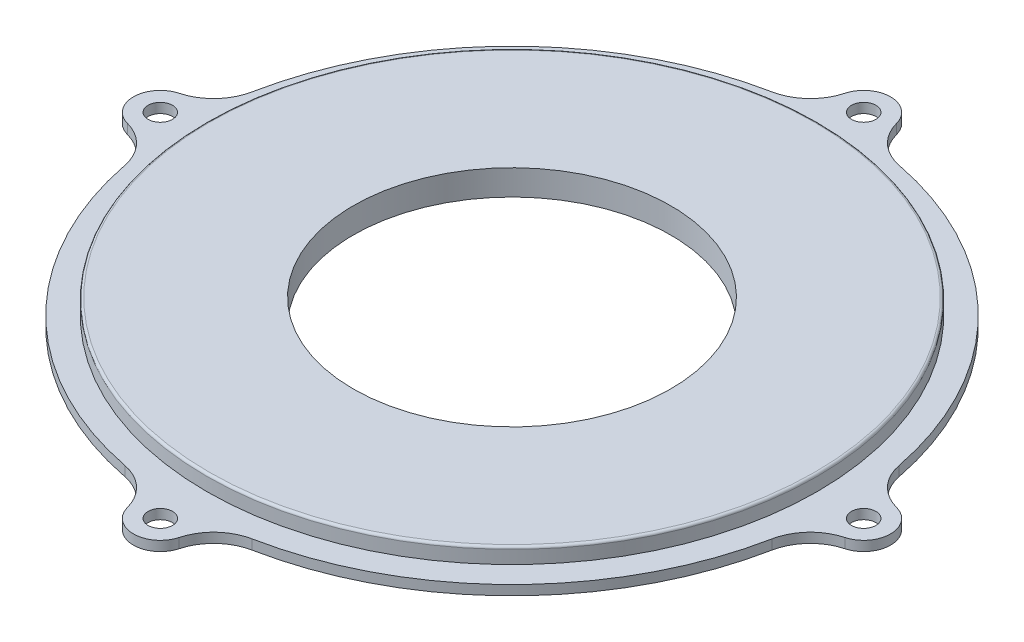
ISO-10303-21;
HEADER;
FILE_DESCRIPTION(('STEP AP214'),'2;1');
FILE_NAME('part.step','',(''),(''),'','','');
FILE_SCHEMA(('AUTOMOTIVE_DESIGN { 1 0 10303 214 1 1 1 1 }'));
ENDSEC;
DATA;
#1=APPLICATION_CONTEXT('core data for automotive mechanical design processes');
#2=APPLICATION_PROTOCOL_DEFINITION('international standard','automotive_design',2000,#1);
#3=PRODUCT_CONTEXT('',#1,'mechanical');
#4=PRODUCT('Part','Part','',(#3));
#5=PRODUCT_RELATED_PRODUCT_CATEGORY('part','',(#4));
#6=PRODUCT_DEFINITION_FORMATION('','',#4);
#7=PRODUCT_DEFINITION_CONTEXT('part definition',#1,'design');
#8=PRODUCT_DEFINITION('design','',#6,#7);
#9=PRODUCT_DEFINITION_SHAPE('','',#8);
#10=(LENGTH_UNIT() NAMED_UNIT(*) SI_UNIT(.MILLI.,.METRE.));
#11=(NAMED_UNIT(*) PLANE_ANGLE_UNIT() SI_UNIT($,.RADIAN.));
#12=(NAMED_UNIT(*) SI_UNIT($,.STERADIAN.) SOLID_ANGLE_UNIT());
#13=UNCERTAINTY_MEASURE_WITH_UNIT(LENGTH_MEASURE(1.E-05),#10,'distance_accuracy_value','');
#14=(GEOMETRIC_REPRESENTATION_CONTEXT(3) GLOBAL_UNCERTAINTY_ASSIGNED_CONTEXT((#13)) GLOBAL_UNIT_ASSIGNED_CONTEXT((#10,
#11,#12)) REPRESENTATION_CONTEXT('',''));
#15=CARTESIAN_POINT('',(0.,0.,0.));
#16=DIRECTION('',(0.,0.,1.));
#17=DIRECTION('',(1.,0.,0.));
#18=AXIS2_PLACEMENT_3D('',#15,#16,#17);
#19=CARTESIAN_POINT('',(0.,-2.,0.));
#20=DIRECTION('',(0.,1.,0.));
#21=DIRECTION('',(0.,0.,1.));
#22=AXIS2_PLACEMENT_3D('',#19,#20,#21);
#23=CYLINDRICAL_SURFACE('',#22,67.5);
#24=DIRECTION('',(0.,-1.,0.));
#25=VECTOR('',#24,1.);
#26=CARTESIAN_POINT('',(13.0329760411852,0.,-66.2298387096775));
#27=LINE('',#26,#25);
#28=CARTESIAN_POINT('',(13.0329760411852,0.,-66.2298387096775));
#29=VERTEX_POINT('',#28);
#30=CARTESIAN_POINT('',(13.0329760411852,-2.,-66.2298387096775));
#31=VERTEX_POINT('',#30);
#32=EDGE_CURVE('E242',#29,#31,#27,.T.);
#33=ORIENTED_EDGE('',*,*,#32,.F.);
#34=CARTESIAN_POINT('',(0.,0.,0.));
#35=DIRECTION('',(0.,-1.,0.));
#36=DIRECTION('',(0.,0.,-1.));
#37=AXIS2_PLACEMENT_3D('',#34,#35,#36);
#38=CIRCLE('',#37,67.5);
#39=CARTESIAN_POINT('',(66.2298387096774,0.,-13.0329760411855));
#40=VERTEX_POINT('',#39);
#41=EDGE_CURVE('E281',#29,#40,#38,.T.);
#42=ORIENTED_EDGE('',*,*,#41,.T.);
#43=DIRECTION('',(0.,-1.,0.));
#44=VECTOR('',#43,1.);
#45=CARTESIAN_POINT('',(66.2298387096774,0.,-13.0329760411855));
#46=LINE('',#45,#44);
#47=CARTESIAN_POINT('',(66.2298387096774,-2.,-13.0329760411855));
#48=VERTEX_POINT('',#47);
#49=EDGE_CURVE('E284',#40,#48,#46,.T.);
#50=ORIENTED_EDGE('',*,*,#49,.T.);
#51=CARTESIAN_POINT('',(0.,-2.,0.));
#52=DIRECTION('',(0.,-1.,0.));
#53=DIRECTION('',(0.,0.,-1.));
#54=AXIS2_PLACEMENT_3D('',#51,#52,#53);
#55=CIRCLE('',#54,67.5);
#56=EDGE_CURVE('E294',#31,#48,#55,.T.);
#57=ORIENTED_EDGE('',*,*,#56,.F.);
#58=EDGE_LOOP('',(#33,#42,#50,#57));
#59=FACE_BOUND('',#58,.T.);
#60=ADVANCED_FACE('F43',(#59),#23,.T.);
#61=DIRECTION('',(0.,-1.,0.));
#62=VECTOR('',#61,1.);
#63=CARTESIAN_POINT('',(-13.0329760411848,0.,66.2298387096776));
#64=LINE('',#63,#62);
#65=CARTESIAN_POINT('',(-13.0329760411848,0.,66.2298387096776));
#66=VERTEX_POINT('',#65);
#67=CARTESIAN_POINT('',(-13.0329760411848,-2.,66.2298387096776));
#68=VERTEX_POINT('',#67);
#69=EDGE_CURVE('E183',#66,#68,#64,.T.);
#70=ORIENTED_EDGE('',*,*,#69,.F.);
#71=CARTESIAN_POINT('',(-66.2298387096774,0.,13.0329760411855));
#72=VERTEX_POINT('',#71);
#73=EDGE_CURVE('E297',#66,#72,#38,.T.);
#74=ORIENTED_EDGE('',*,*,#73,.T.);
#75=DIRECTION('',(0.,-1.,0.));
#76=VECTOR('',#75,1.);
#77=CARTESIAN_POINT('',(-66.2298387096774,0.,13.0329760411855));
#78=LINE('',#77,#76);
#79=CARTESIAN_POINT('',(-66.2298387096774,-2.,13.0329760411855));
#80=VERTEX_POINT('',#79);
#81=EDGE_CURVE('E224',#72,#80,#78,.T.);
#82=ORIENTED_EDGE('',*,*,#81,.T.);
#83=EDGE_CURVE('E293',#68,#80,#55,.T.);
#84=ORIENTED_EDGE('',*,*,#83,.F.);
#85=EDGE_LOOP('',(#70,#74,#82,#84));
#86=FACE_BOUND('',#85,.T.);
#87=ADVANCED_FACE('F320',(#86),#23,.T.);
#88=CARTESIAN_POINT('',(-66.2298387096774,0.,-13.0329760411855));
#89=VERTEX_POINT('',#88);
#90=CARTESIAN_POINT('',(-13.0329760411857,0.,-66.2298387096774));
#91=VERTEX_POINT('',#90);
#92=EDGE_CURVE('E357',#89,#91,#38,.T.);
#93=ORIENTED_EDGE('',*,*,#92,.T.);
#94=DIRECTION('',(0.,-1.,0.));
#95=VECTOR('',#94,1.);
#96=CARTESIAN_POINT('',(-13.0329760411857,0.,-66.2298387096774));
#97=LINE('',#96,#95);
#98=CARTESIAN_POINT('',(-13.0329760411857,-2.,-66.2298387096774));
#99=VERTEX_POINT('',#98);
#100=EDGE_CURVE('E253',#91,#99,#97,.T.);
#101=ORIENTED_EDGE('',*,*,#100,.T.);
#102=CARTESIAN_POINT('',(-66.2298387096774,-2.,-13.0329760411855));
#103=VERTEX_POINT('',#102);
#104=EDGE_CURVE('E627',#103,#99,#55,.T.);
#105=ORIENTED_EDGE('',*,*,#104,.F.);
#106=DIRECTION('',(0.,-1.,0.));
#107=VECTOR('',#106,1.);
#108=CARTESIAN_POINT('',(-66.2298387096774,0.,-13.0329760411855));
#109=LINE('',#108,#107);
#110=EDGE_CURVE('E214',#89,#103,#109,.T.);
#111=ORIENTED_EDGE('',*,*,#110,.F.);
#112=EDGE_LOOP('',(#93,#101,#105,#111));
#113=FACE_BOUND('',#112,.T.);
#114=ADVANCED_FACE('F327',(#113),#23,.T.);
#115=CARTESIAN_POINT('',(66.2298387096774,0.,13.0329760411855));
#116=VERTEX_POINT('',#115);
#117=CARTESIAN_POINT('',(13.0329760411862,0.,66.2298387096773));
#118=VERTEX_POINT('',#117);
#119=EDGE_CURVE('E295',#116,#118,#38,.T.);
#120=ORIENTED_EDGE('',*,*,#119,.T.);
#121=DIRECTION('',(0.,-1.,0.));
#122=VECTOR('',#121,1.);
#123=CARTESIAN_POINT('',(13.0329760411862,0.,66.2298387096773));
#124=LINE('',#123,#122);
#125=CARTESIAN_POINT('',(13.0329760411862,-2.,66.2298387096773));
#126=VERTEX_POINT('',#125);
#127=EDGE_CURVE('E168',#118,#126,#124,.T.);
#128=ORIENTED_EDGE('',*,*,#127,.T.);
#129=CARTESIAN_POINT('',(66.2298387096774,-2.,13.0329760411855));
#130=VERTEX_POINT('',#129);
#131=EDGE_CURVE('E289',#130,#126,#55,.T.);
#132=ORIENTED_EDGE('',*,*,#131,.F.);
#133=DIRECTION('',(0.,-1.,0.));
#134=VECTOR('',#133,1.);
#135=CARTESIAN_POINT('',(66.2298387096774,0.,13.0329760411855));
#136=LINE('',#135,#134);
#137=EDGE_CURVE('E272',#116,#130,#136,.T.);
#138=ORIENTED_EDGE('',*,*,#137,.F.);
#139=EDGE_LOOP('',(#120,#128,#132,#138));
#140=FACE_BOUND('',#139,.T.);
#141=ADVANCED_FACE('F323',(#140),#23,.T.);
#142=CARTESIAN_POINT('',(0.,9.,0.));
#143=DIRECTION('',(0.,-1.,0.));
#144=DIRECTION('',(0.,0.,-1.));
#145=AXIS2_PLACEMENT_3D('',#142,#143,#144);
#146=CYLINDRICAL_SURFACE('',#145,62.5);
#147=CARTESIAN_POINT('',(0.,2.7,0.));
#148=DIRECTION('',(0.,1.,0.));
#149=DIRECTION('',(0.,0.,1.));
#150=AXIS2_PLACEMENT_3D('',#147,#148,#149);
#151=CIRCLE('',#150,62.5);
#152=CARTESIAN_POINT('',(0.,2.7,62.5));
#153=VERTEX_POINT('',#152);
#154=EDGE_CURVE('E51',#153,#153,#151,.F.);
#155=ORIENTED_EDGE('',*,*,#154,.T.);
#156=EDGE_LOOP('',(#155));
#157=FACE_BOUND('',#156,.T.);
#158=CARTESIAN_POINT('',(0.,0.,0.));
#159=DIRECTION('',(0.,1.,0.));
#160=DIRECTION('',(0.,0.,1.));
#161=AXIS2_PLACEMENT_3D('',#158,#159,#160);
#162=CIRCLE('',#161,62.5);
#163=CARTESIAN_POINT('',(0.,0.,62.5));
#164=VERTEX_POINT('',#163);
#165=EDGE_CURVE('E292',#164,#164,#162,.T.);
#166=ORIENTED_EDGE('',*,*,#165,.T.);
#167=EDGE_LOOP('',(#166));
#168=FACE_BOUND('',#167,.T.);
#169=ADVANCED_FACE('F306',(#157,#168),#146,.T.);
#170=CARTESIAN_POINT('',(0.,3.2,0.));
#171=DIRECTION('',(0.,1.,0.));
#172=DIRECTION('',(0.,0.,1.));
#173=AXIS2_PLACEMENT_3D('',#170,#171,#172);
#174=PLANE('',#173);
#175=CARTESIAN_POINT('',(0.,3.2,0.));
#176=DIRECTION('',(0.,1.,0.));
#177=DIRECTION('',(0.,0.,1.));
#178=AXIS2_PLACEMENT_3D('',#175,#176,#177);
#179=CIRCLE('',#178,62.);
#180=CARTESIAN_POINT('',(0.,3.2,62.));
#181=VERTEX_POINT('',#180);
#182=EDGE_CURVE('E12',#181,#181,#179,.T.);
#183=ORIENTED_EDGE('',*,*,#182,.T.);
#184=EDGE_LOOP('',(#183));
#185=FACE_BOUND('',#184,.T.);
#186=CARTESIAN_POINT('',(0.,3.2,0.));
#187=DIRECTION('',(0.,1.,0.));
#188=DIRECTION('',(0.,0.,1.));
#189=AXIS2_PLACEMENT_3D('',#186,#187,#188);
#190=CIRCLE('',#189,32.5);
#191=CARTESIAN_POINT('',(0.,3.2,32.5));
#192=VERTEX_POINT('',#191);
#193=EDGE_CURVE('E300',#192,#192,#190,.T.);
#194=ORIENTED_EDGE('',*,*,#193,.F.);
#195=EDGE_LOOP('',(#194));
#196=FACE_BOUND('',#195,.T.);
#197=ADVANCED_FACE('F338',(#185,#196),#174,.T.);
#198=CARTESIAN_POINT('',(0.,-2.,0.));
#199=DIRECTION('',(0.,-1.,0.));
#200=DIRECTION('',(0.,0.,-1.));
#201=AXIS2_PLACEMENT_3D('',#198,#199,#200);
#202=PLANE('',#201);
#203=CARTESIAN_POINT('',(0.,-2.,0.));
#204=DIRECTION('',(0.,1.,0.));
#205=DIRECTION('',(0.,0.,1.));
#206=AXIS2_PLACEMENT_3D('',#203,#204,#205);
#207=CIRCLE('',#206,32.5);
#208=CARTESIAN_POINT('',(0.,-2.,32.5));
#209=VERTEX_POINT('',#208);
#210=EDGE_CURVE('E302',#209,#209,#207,.T.);
#211=ORIENTED_EDGE('',*,*,#210,.T.);
#212=EDGE_LOOP('',(#211));
#213=FACE_BOUND('',#212,.T.);
#214=ORIENTED_EDGE('',*,*,#56,.T.);
#215=CARTESIAN_POINT('',(76.0416666666667,-2.,-14.9637873065463));
#216=DIRECTION('',(0.,1.,0.));
#217=DIRECTION('',(0.,0.,1.));
#218=AXIS2_PLACEMENT_3D('',#215,#216,#217);
#219=CIRCLE('',#218,10.);
#220=CARTESIAN_POINT('',(73.4341397849462,-2.,-5.30973097974223));
#221=VERTEX_POINT('',#220);
#222=EDGE_CURVE('E274',#48,#221,#219,.T.);
#223=ORIENTED_EDGE('',*,*,#222,.T.);
#224=CARTESIAN_POINT('',(72.,-2.,0.));
#225=DIRECTION('',(0.,-1.,0.));
#226=DIRECTION('',(0.,0.,-1.));
#227=AXIS2_PLACEMENT_3D('',#224,#225,#226);
#228=CIRCLE('',#227,5.5);
#229=CARTESIAN_POINT('',(73.4341397849462,-2.,5.30973097974223));
#230=VERTEX_POINT('',#229);
#231=EDGE_CURVE('E266',#221,#230,#228,.T.);
#232=ORIENTED_EDGE('',*,*,#231,.T.);
#233=CARTESIAN_POINT('',(76.0416666666667,-2.,14.9637873065463));
#234=DIRECTION('',(0.,1.,0.));
#235=DIRECTION('',(0.,0.,-1.));
#236=AXIS2_PLACEMENT_3D('',#233,#234,#235);
#237=CIRCLE('',#236,10.);
#238=EDGE_CURVE('E260',#230,#130,#237,.T.);
#239=ORIENTED_EDGE('',*,*,#238,.T.);
#240=ORIENTED_EDGE('',*,*,#131,.T.);
#241=CARTESIAN_POINT('',(14.9637873065471,-2.,76.0416666666665));
#242=DIRECTION('',(0.,1.,0.));
#243=DIRECTION('',(-1.,0.,0.));
#244=AXIS2_PLACEMENT_3D('',#241,#242,#243);
#245=CIRCLE('',#244,10.);
#246=CARTESIAN_POINT('',(5.309730979743,-2.,73.4341397849462));
#247=VERTEX_POINT('',#246);
#248=EDGE_CURVE('E192',#126,#247,#245,.T.);
#249=ORIENTED_EDGE('',*,*,#248,.T.);
#250=CARTESIAN_POINT('',(7.54159969190117E-13,-2.,72.));
#251=DIRECTION('',(0.,-1.,0.));
#252=DIRECTION('',(1.,0.,0.));
#253=AXIS2_PLACEMENT_3D('',#250,#251,#252);
#254=CIRCLE('',#253,5.5);
#255=CARTESIAN_POINT('',(-5.30973097974146,-2.,73.4341397849463));
#256=VERTEX_POINT('',#255);
#257=EDGE_CURVE('E163',#247,#256,#254,.T.);
#258=ORIENTED_EDGE('',*,*,#257,.T.);
#259=CARTESIAN_POINT('',(-14.9637873065455,-2.,76.0416666666668));
#260=DIRECTION('',(0.,1.,0.));
#261=DIRECTION('',(1.,0.,0.));
#262=AXIS2_PLACEMENT_3D('',#259,#260,#261);
#263=CIRCLE('',#262,10.);
#264=EDGE_CURVE('E189',#256,#68,#263,.T.);
#265=ORIENTED_EDGE('',*,*,#264,.T.);
#266=ORIENTED_EDGE('',*,*,#83,.T.);
#267=CARTESIAN_POINT('',(-76.0416666666667,-2.,14.9637873065463));
#268=DIRECTION('',(0.,1.,0.));
#269=DIRECTION('',(0.,0.,-1.));
#270=AXIS2_PLACEMENT_3D('',#267,#268,#269);
#271=CIRCLE('',#270,10.);
#272=CARTESIAN_POINT('',(-73.4341397849462,-2.,5.30973097974223));
#273=VERTEX_POINT('',#272);
#274=EDGE_CURVE('E66',#80,#273,#271,.T.);
#275=ORIENTED_EDGE('',*,*,#274,.T.);
#276=CARTESIAN_POINT('',(-72.,-2.,0.));
#277=DIRECTION('',(0.,-1.,0.));
#278=DIRECTION('',(0.,0.,1.));
#279=AXIS2_PLACEMENT_3D('',#276,#277,#278);
#280=CIRCLE('',#279,5.5);
#281=CARTESIAN_POINT('',(-73.4341397849462,-2.,-5.30973097974223));
#282=VERTEX_POINT('',#281);
#283=EDGE_CURVE('E208',#273,#282,#280,.T.);
#284=ORIENTED_EDGE('',*,*,#283,.T.);
#285=CARTESIAN_POINT('',(-76.0416666666667,-2.,-14.9637873065463));
#286=DIRECTION('',(0.,1.,0.));
#287=DIRECTION('',(0.,0.,1.));
#288=AXIS2_PLACEMENT_3D('',#285,#286,#287);
#289=CIRCLE('',#288,10.);
#290=EDGE_CURVE('E202',#282,#103,#289,.T.);
#291=ORIENTED_EDGE('',*,*,#290,.T.);
#292=ORIENTED_EDGE('',*,*,#104,.T.);
#293=CARTESIAN_POINT('',(-14.9637873065465,-2.,-76.0416666666666));
#294=DIRECTION('',(0.,1.,0.));
#295=DIRECTION('',(1.,0.,0.));
#296=AXIS2_PLACEMENT_3D('',#293,#294,#295);
#297=CIRCLE('',#296,10.);
#298=CARTESIAN_POINT('',(-5.30973097974249,-2.,-73.4341397849462));
#299=VERTEX_POINT('',#298);
#300=EDGE_CURVE('E244',#99,#299,#297,.T.);
#301=ORIENTED_EDGE('',*,*,#300,.T.);
#302=CARTESIAN_POINT('',(-2.51386656396706E-13,-2.,-72.));
#303=DIRECTION('',(0.,-1.,0.));
#304=DIRECTION('',(-1.,0.,0.));
#305=AXIS2_PLACEMENT_3D('',#302,#303,#304);
#306=CIRCLE('',#305,5.5);
#307=CARTESIAN_POINT('',(5.30973097974197,-2.,-73.4341397849462));
#308=VERTEX_POINT('',#307);
#309=EDGE_CURVE('E236',#299,#308,#306,.T.);
#310=ORIENTED_EDGE('',*,*,#309,.T.);
#311=CARTESIAN_POINT('',(14.963787306546,-2.,-76.0416666666667));
#312=DIRECTION('',(0.,1.,0.));
#313=DIRECTION('',(-1.,0.,0.));
#314=AXIS2_PLACEMENT_3D('',#311,#312,#313);
#315=CIRCLE('',#314,10.);
#316=EDGE_CURVE('E58',#308,#31,#315,.T.);
#317=ORIENTED_EDGE('',*,*,#316,.T.);
#318=EDGE_LOOP('',(#214,#223,#232,#239,#240,#249,#258,#265,#266,#275,#284,#291,#292,#301,#310,#317));
#319=FACE_BOUND('',#318,.T.);
#320=CARTESIAN_POINT('',(72.,-2.,0.));
#321=DIRECTION('',(0.,-1.,0.));
#322=DIRECTION('',(0.,0.,-1.));
#323=AXIS2_PLACEMENT_3D('',#320,#321,#322);
#324=CIRCLE('',#323,2.49999999999999);
#325=CARTESIAN_POINT('',(72.,-2.,-2.49999999999999));
#326=VERTEX_POINT('',#325);
#327=EDGE_CURVE('E250',#326,#326,#324,.T.);
#328=ORIENTED_EDGE('',*,*,#327,.F.);
#329=EDGE_LOOP('',(#328));
#330=FACE_BOUND('',#329,.T.);
#331=CARTESIAN_POINT('',(-2.51386656396706E-13,-2.,-72.));
#332=DIRECTION('',(0.,-1.,0.));
#333=DIRECTION('',(-1.,0.,0.));
#334=AXIS2_PLACEMENT_3D('',#331,#332,#333);
#335=CIRCLE('',#334,2.49999999999999);
#336=CARTESIAN_POINT('',(-2.50000000000025,-2.,-72.));
#337=VERTEX_POINT('',#336);
#338=EDGE_CURVE('E221',#337,#337,#335,.T.);
#339=ORIENTED_EDGE('',*,*,#338,.F.);
#340=EDGE_LOOP('',(#339));
#341=FACE_BOUND('',#340,.T.);
#342=CARTESIAN_POINT('',(-72.,-2.,0.));
#343=DIRECTION('',(0.,-1.,0.));
#344=DIRECTION('',(0.,0.,1.));
#345=AXIS2_PLACEMENT_3D('',#342,#343,#344);
#346=CIRCLE('',#345,2.49999999999999);
#347=CARTESIAN_POINT('',(-72.,-2.,2.49999999999999));
#348=VERTEX_POINT('',#347);
#349=EDGE_CURVE('E196',#348,#348,#346,.T.);
#350=ORIENTED_EDGE('',*,*,#349,.F.);
#351=EDGE_LOOP('',(#350));
#352=FACE_BOUND('',#351,.T.);
#353=CARTESIAN_POINT('',(7.54159969190117E-13,-2.,72.));
#354=DIRECTION('',(0.,-1.,0.));
#355=DIRECTION('',(1.,0.,0.));
#356=AXIS2_PLACEMENT_3D('',#353,#354,#355);
#357=CIRCLE('',#356,2.49999999999999);
#358=CARTESIAN_POINT('',(2.50000000000075,-2.,72.));
#359=VERTEX_POINT('',#358);
#360=EDGE_CURVE('E369',#359,#359,#357,.T.);
#361=ORIENTED_EDGE('',*,*,#360,.F.);
#362=EDGE_LOOP('',(#361));
#363=FACE_BOUND('',#362,.T.);
#364=ADVANCED_FACE('F377',(#213,#319,#330,#341,#352,#363),#202,.T.);
#365=CARTESIAN_POINT('',(0.,0.,0.));
#366=DIRECTION('',(0.,-1.,0.));
#367=DIRECTION('',(0.,0.,-1.));
#368=AXIS2_PLACEMENT_3D('',#365,#366,#367);
#369=PLANE('',#368);
#370=ORIENTED_EDGE('',*,*,#119,.F.);
#371=CARTESIAN_POINT('',(76.0416666666667,0.,14.9637873065463));
#372=DIRECTION('',(0.,1.,0.));
#373=DIRECTION('',(0.,0.,-1.));
#374=AXIS2_PLACEMENT_3D('',#371,#372,#373);
#375=CIRCLE('',#374,10.);
#376=CARTESIAN_POINT('',(73.4341397849462,0.,5.30973097974223));
#377=VERTEX_POINT('',#376);
#378=EDGE_CURVE('E263',#377,#116,#375,.T.);
#379=ORIENTED_EDGE('',*,*,#378,.F.);
#380=CARTESIAN_POINT('',(72.,0.,0.));
#381=DIRECTION('',(0.,-1.,0.));
#382=DIRECTION('',(0.,0.,-1.));
#383=AXIS2_PLACEMENT_3D('',#380,#381,#382);
#384=CIRCLE('',#383,5.5);
#385=CARTESIAN_POINT('',(73.4341397849462,0.,-5.30973097974223));
#386=VERTEX_POINT('',#385);
#387=EDGE_CURVE('E269',#386,#377,#384,.T.);
#388=ORIENTED_EDGE('',*,*,#387,.F.);
#389=CARTESIAN_POINT('',(76.0416666666667,0.,-14.9637873065463));
#390=DIRECTION('',(0.,1.,0.));
#391=DIRECTION('',(0.,0.,1.));
#392=AXIS2_PLACEMENT_3D('',#389,#390,#391);
#393=CIRCLE('',#392,10.);
#394=EDGE_CURVE('E265',#40,#386,#393,.T.);
#395=ORIENTED_EDGE('',*,*,#394,.F.);
#396=ORIENTED_EDGE('',*,*,#41,.F.);
#397=CARTESIAN_POINT('',(14.963787306546,0.,-76.0416666666667));
#398=DIRECTION('',(0.,1.,0.));
#399=DIRECTION('',(-1.,0.,0.));
#400=AXIS2_PLACEMENT_3D('',#397,#398,#399);
#401=CIRCLE('',#400,10.);
#402=CARTESIAN_POINT('',(5.30973097974197,0.,-73.4341397849462));
#403=VERTEX_POINT('',#402);
#404=EDGE_CURVE('E233',#403,#29,#401,.T.);
#405=ORIENTED_EDGE('',*,*,#404,.F.);
#406=CARTESIAN_POINT('',(-2.51386656396706E-13,0.,-72.));
#407=DIRECTION('',(0.,-1.,0.));
#408=DIRECTION('',(-1.,0.,0.));
#409=AXIS2_PLACEMENT_3D('',#406,#407,#408);
#410=CIRCLE('',#409,5.5);
#411=CARTESIAN_POINT('',(-5.30973097974249,0.,-73.4341397849462));
#412=VERTEX_POINT('',#411);
#413=EDGE_CURVE('E239',#412,#403,#410,.T.);
#414=ORIENTED_EDGE('',*,*,#413,.F.);
#415=CARTESIAN_POINT('',(-14.9637873065465,0.,-76.0416666666666));
#416=DIRECTION('',(0.,1.,0.));
#417=DIRECTION('',(1.,0.,0.));
#418=AXIS2_PLACEMENT_3D('',#415,#416,#417);
#419=CIRCLE('',#418,10.);
#420=EDGE_CURVE('E235',#91,#412,#419,.T.);
#421=ORIENTED_EDGE('',*,*,#420,.F.);
#422=ORIENTED_EDGE('',*,*,#92,.F.);
#423=CARTESIAN_POINT('',(-76.0416666666667,0.,-14.9637873065463));
#424=DIRECTION('',(0.,1.,0.));
#425=DIRECTION('',(0.,0.,1.));
#426=AXIS2_PLACEMENT_3D('',#423,#424,#425);
#427=CIRCLE('',#426,10.);
#428=CARTESIAN_POINT('',(-73.4341397849462,0.,-5.30973097974223));
#429=VERTEX_POINT('',#428);
#430=EDGE_CURVE('E205',#429,#89,#427,.T.);
#431=ORIENTED_EDGE('',*,*,#430,.F.);
#432=CARTESIAN_POINT('',(-72.,0.,0.));
#433=DIRECTION('',(0.,-1.,0.));
#434=DIRECTION('',(0.,0.,1.));
#435=AXIS2_PLACEMENT_3D('',#432,#433,#434);
#436=CIRCLE('',#435,5.5);
#437=CARTESIAN_POINT('',(-73.4341397849462,0.,5.30973097974223));
#438=VERTEX_POINT('',#437);
#439=EDGE_CURVE('E211',#438,#429,#436,.T.);
#440=ORIENTED_EDGE('',*,*,#439,.F.);
#441=CARTESIAN_POINT('',(-76.0416666666667,0.,14.9637873065463));
#442=DIRECTION('',(0.,1.,0.));
#443=DIRECTION('',(0.,0.,-1.));
#444=AXIS2_PLACEMENT_3D('',#441,#442,#443);
#445=CIRCLE('',#444,10.);
#446=EDGE_CURVE('E207',#72,#438,#445,.T.);
#447=ORIENTED_EDGE('',*,*,#446,.F.);
#448=ORIENTED_EDGE('',*,*,#73,.F.);
#449=CARTESIAN_POINT('',(-14.9637873065455,0.,76.0416666666668));
#450=DIRECTION('',(0.,1.,0.));
#451=DIRECTION('',(1.,0.,0.));
#452=AXIS2_PLACEMENT_3D('',#449,#450,#451);
#453=CIRCLE('',#452,10.);
#454=CARTESIAN_POINT('',(-5.30973097974146,0.,73.4341397849463));
#455=VERTEX_POINT('',#454);
#456=EDGE_CURVE('E176',#455,#66,#453,.T.);
#457=ORIENTED_EDGE('',*,*,#456,.F.);
#458=CARTESIAN_POINT('',(7.54159969190117E-13,0.,72.));
#459=DIRECTION('',(0.,-1.,0.));
#460=DIRECTION('',(1.,0.,0.));
#461=AXIS2_PLACEMENT_3D('',#458,#459,#460);
#462=CIRCLE('',#461,5.5);
#463=CARTESIAN_POINT('',(5.309730979743,0.,73.4341397849462));
#464=VERTEX_POINT('',#463);
#465=EDGE_CURVE('E161',#464,#455,#462,.T.);
#466=ORIENTED_EDGE('',*,*,#465,.F.);
#467=CARTESIAN_POINT('',(14.9637873065471,0.,76.0416666666665));
#468=DIRECTION('',(0.,1.,0.));
#469=DIRECTION('',(-1.,0.,0.));
#470=AXIS2_PLACEMENT_3D('',#467,#468,#469);
#471=CIRCLE('',#470,10.);
#472=EDGE_CURVE('E172',#118,#464,#471,.T.);
#473=ORIENTED_EDGE('',*,*,#472,.F.);
#474=EDGE_LOOP('',(#370,#379,#388,#395,#396,#405,#414,#421,#422,#431,#440,#447,#448,#457,#466,#473));
#475=FACE_BOUND('',#474,.T.);
#476=ORIENTED_EDGE('',*,*,#165,.F.);
#477=EDGE_LOOP('',(#476));
#478=FACE_BOUND('',#477,.T.);
#479=CARTESIAN_POINT('',(72.,0.,0.));
#480=DIRECTION('',(0.,-1.,0.));
#481=DIRECTION('',(0.,0.,-1.));
#482=AXIS2_PLACEMENT_3D('',#479,#480,#481);
#483=CIRCLE('',#482,2.49999999999999);
#484=CARTESIAN_POINT('',(72.,0.,-2.49999999999999));
#485=VERTEX_POINT('',#484);
#486=EDGE_CURVE('E257',#485,#485,#483,.T.);
#487=ORIENTED_EDGE('',*,*,#486,.T.);
#488=EDGE_LOOP('',(#487));
#489=FACE_BOUND('',#488,.T.);
#490=CARTESIAN_POINT('',(-2.51386656396706E-13,0.,-72.));
#491=DIRECTION('',(0.,-1.,0.));
#492=DIRECTION('',(-1.,0.,0.));
#493=AXIS2_PLACEMENT_3D('',#490,#491,#492);
#494=CIRCLE('',#493,2.49999999999999);
#495=CARTESIAN_POINT('',(-2.50000000000025,0.,-72.));
#496=VERTEX_POINT('',#495);
#497=EDGE_CURVE('E228',#496,#496,#494,.T.);
#498=ORIENTED_EDGE('',*,*,#497,.T.);
#499=EDGE_LOOP('',(#498));
#500=FACE_BOUND('',#499,.T.);
#501=CARTESIAN_POINT('',(-72.,0.,0.));
#502=DIRECTION('',(0.,-1.,0.));
#503=DIRECTION('',(0.,0.,1.));
#504=AXIS2_PLACEMENT_3D('',#501,#502,#503);
#505=CIRCLE('',#504,2.49999999999999);
#506=CARTESIAN_POINT('',(-72.,0.,2.49999999999999));
#507=VERTEX_POINT('',#506);
#508=EDGE_CURVE('E199',#507,#507,#505,.T.);
#509=ORIENTED_EDGE('',*,*,#508,.T.);
#510=EDGE_LOOP('',(#509));
#511=FACE_BOUND('',#510,.T.);
#512=CARTESIAN_POINT('',(7.54159969190117E-13,0.,72.));
#513=DIRECTION('',(0.,-1.,0.));
#514=DIRECTION('',(1.,0.,0.));
#515=AXIS2_PLACEMENT_3D('',#512,#513,#514);
#516=CIRCLE('',#515,2.49999999999999);
#517=CARTESIAN_POINT('',(2.50000000000075,0.,72.));
#518=VERTEX_POINT('',#517);
#519=EDGE_CURVE('E193',#518,#518,#516,.T.);
#520=ORIENTED_EDGE('',*,*,#519,.T.);
#521=EDGE_LOOP('',(#520));
#522=FACE_BOUND('',#521,.T.);
#523=ADVANCED_FACE('F179',(#475,#478,#489,#500,#511,#522),#369,.F.);
#524=CARTESIAN_POINT('',(76.0416666666667,0.,14.9637873065463));
#525=DIRECTION('',(0.,-1.,0.));
#526=DIRECTION('',(0.,0.,-1.));
#527=AXIS2_PLACEMENT_3D('',#524,#525,#526);
#528=CYLINDRICAL_SURFACE('',#527,10.);
#529=ORIENTED_EDGE('',*,*,#238,.F.);
#530=DIRECTION('',(0.,-1.,0.));
#531=VECTOR('',#530,1.);
#532=CARTESIAN_POINT('',(73.4341397849462,0.,5.30973097974223));
#533=LINE('',#532,#531);
#534=EDGE_CURVE('E279',#377,#230,#533,.T.);
#535=ORIENTED_EDGE('',*,*,#534,.F.);
#536=ORIENTED_EDGE('',*,*,#378,.T.);
#537=ORIENTED_EDGE('',*,*,#137,.T.);
#538=EDGE_LOOP('',(#529,#535,#536,#537));
#539=FACE_BOUND('',#538,.T.);
#540=ADVANCED_FACE('F390',(#539),#528,.F.);
#541=CARTESIAN_POINT('',(72.,0.,0.));
#542=DIRECTION('',(0.,-1.,0.));
#543=DIRECTION('',(0.,0.,-1.));
#544=AXIS2_PLACEMENT_3D('',#541,#542,#543);
#545=CYLINDRICAL_SURFACE('',#544,5.5);
#546=ORIENTED_EDGE('',*,*,#231,.F.);
#547=DIRECTION('',(0.,-1.,0.));
#548=VECTOR('',#547,1.);
#549=CARTESIAN_POINT('',(73.4341397849462,0.,-5.30973097974223));
#550=LINE('',#549,#548);
#551=EDGE_CURVE('E282',#386,#221,#550,.T.);
#552=ORIENTED_EDGE('',*,*,#551,.F.);
#553=ORIENTED_EDGE('',*,*,#387,.T.);
#554=ORIENTED_EDGE('',*,*,#534,.T.);
#555=EDGE_LOOP('',(#546,#552,#553,#554));
#556=FACE_BOUND('',#555,.T.);
#557=ADVANCED_FACE('F348',(#556),#545,.T.);
#558=CARTESIAN_POINT('',(76.0416666666667,0.,-14.9637873065463));
#559=DIRECTION('',(0.,-1.,0.));
#560=DIRECTION('',(0.,0.,-1.));
#561=AXIS2_PLACEMENT_3D('',#558,#559,#560);
#562=CYLINDRICAL_SURFACE('',#561,10.);
#563=ORIENTED_EDGE('',*,*,#222,.F.);
#564=ORIENTED_EDGE('',*,*,#49,.F.);
#565=ORIENTED_EDGE('',*,*,#394,.T.);
#566=ORIENTED_EDGE('',*,*,#551,.T.);
#567=EDGE_LOOP('',(#563,#564,#565,#566));
#568=FACE_BOUND('',#567,.T.);
#569=ADVANCED_FACE('F353',(#568),#562,.F.);
#570=CARTESIAN_POINT('',(72.,0.,0.));
#571=DIRECTION('',(0.,-1.,0.));
#572=DIRECTION('',(0.,0.,-1.));
#573=AXIS2_PLACEMENT_3D('',#570,#571,#572);
#574=CYLINDRICAL_SURFACE('',#573,2.49999999999999);
#575=ORIENTED_EDGE('',*,*,#486,.F.);
#576=EDGE_LOOP('',(#575));
#577=FACE_BOUND('',#576,.T.);
#578=ORIENTED_EDGE('',*,*,#327,.T.);
#579=EDGE_LOOP('',(#578));
#580=FACE_BOUND('',#579,.T.);
#581=ADVANCED_FACE('F396',(#577,#580),#574,.F.);
#582=CARTESIAN_POINT('',(-72.,0.,0.));
#583=DIRECTION('',(0.,-1.,0.));
#584=DIRECTION('',(0.,0.,-1.));
#585=AXIS2_PLACEMENT_3D('',#582,#583,#584);
#586=CYLINDRICAL_SURFACE('',#585,2.49999999999999);
#587=ORIENTED_EDGE('',*,*,#508,.F.);
#588=EDGE_LOOP('',(#587));
#589=FACE_BOUND('',#588,.T.);
#590=ORIENTED_EDGE('',*,*,#349,.T.);
#591=EDGE_LOOP('',(#590));
#592=FACE_BOUND('',#591,.T.);
#593=ADVANCED_FACE('F401',(#589,#592),#586,.F.);
#594=CARTESIAN_POINT('',(-72.,0.,0.));
#595=DIRECTION('',(0.,-1.,0.));
#596=DIRECTION('',(0.,0.,-1.));
#597=AXIS2_PLACEMENT_3D('',#594,#595,#596);
#598=CYLINDRICAL_SURFACE('',#597,5.5);
#599=ORIENTED_EDGE('',*,*,#283,.F.);
#600=DIRECTION('',(0.,-1.,0.));
#601=VECTOR('',#600,1.);
#602=CARTESIAN_POINT('',(-73.4341397849462,0.,5.30973097974223));
#603=LINE('',#602,#601);
#604=EDGE_CURVE('E222',#438,#273,#603,.T.);
#605=ORIENTED_EDGE('',*,*,#604,.F.);
#606=ORIENTED_EDGE('',*,*,#439,.T.);
#607=DIRECTION('',(0.,-1.,0.));
#608=VECTOR('',#607,1.);
#609=CARTESIAN_POINT('',(-73.4341397849462,0.,-5.30973097974223));
#610=LINE('',#609,#608);
#611=EDGE_CURVE('E219',#429,#282,#610,.T.);
#612=ORIENTED_EDGE('',*,*,#611,.T.);
#613=EDGE_LOOP('',(#599,#605,#606,#612));
#614=FACE_BOUND('',#613,.T.);
#615=ADVANCED_FACE('F422',(#614),#598,.T.);
#616=CARTESIAN_POINT('',(-76.0416666666667,0.,-14.9637873065463));
#617=DIRECTION('',(0.,-1.,0.));
#618=DIRECTION('',(0.,0.,-1.));
#619=AXIS2_PLACEMENT_3D('',#616,#617,#618);
#620=CYLINDRICAL_SURFACE('',#619,10.);
#621=ORIENTED_EDGE('',*,*,#290,.F.);
#622=ORIENTED_EDGE('',*,*,#611,.F.);
#623=ORIENTED_EDGE('',*,*,#430,.T.);
#624=ORIENTED_EDGE('',*,*,#110,.T.);
#625=EDGE_LOOP('',(#621,#622,#623,#624));
#626=FACE_BOUND('',#625,.T.);
#627=ADVANCED_FACE('F418',(#626),#620,.F.);
#628=CARTESIAN_POINT('',(-76.0416666666667,0.,14.9637873065463));
#629=DIRECTION('',(0.,-1.,0.));
#630=DIRECTION('',(0.,0.,-1.));
#631=AXIS2_PLACEMENT_3D('',#628,#629,#630);
#632=CYLINDRICAL_SURFACE('',#631,10.);
#633=ORIENTED_EDGE('',*,*,#274,.F.);
#634=ORIENTED_EDGE('',*,*,#81,.F.);
#635=ORIENTED_EDGE('',*,*,#446,.T.);
#636=ORIENTED_EDGE('',*,*,#604,.T.);
#637=EDGE_LOOP('',(#633,#634,#635,#636));
#638=FACE_BOUND('',#637,.T.);
#639=ADVANCED_FACE('F421',(#638),#632,.F.);
#640=CARTESIAN_POINT('',(7.54159969190117E-13,0.,72.));
#641=DIRECTION('',(0.,-1.,0.));
#642=DIRECTION('',(0.,0.,-1.));
#643=AXIS2_PLACEMENT_3D('',#640,#641,#642);
#644=CYLINDRICAL_SURFACE('',#643,2.49999999999999);
#645=ORIENTED_EDGE('',*,*,#519,.F.);
#646=EDGE_LOOP('',(#645));
#647=FACE_BOUND('',#646,.T.);
#648=ORIENTED_EDGE('',*,*,#360,.T.);
#649=EDGE_LOOP('',(#648));
#650=FACE_BOUND('',#649,.T.);
#651=ADVANCED_FACE('F426',(#647,#650),#644,.F.);
#652=CARTESIAN_POINT('',(7.54159969190117E-13,0.,72.));
#653=DIRECTION('',(0.,-1.,0.));
#654=DIRECTION('',(0.,0.,-1.));
#655=AXIS2_PLACEMENT_3D('',#652,#653,#654);
#656=CYLINDRICAL_SURFACE('',#655,5.5);
#657=ORIENTED_EDGE('',*,*,#257,.F.);
#658=DIRECTION('',(0.,-1.,0.));
#659=VECTOR('',#658,1.);
#660=CARTESIAN_POINT('',(5.309730979743,0.,73.4341397849462));
#661=LINE('',#660,#659);
#662=EDGE_CURVE('E157',#464,#247,#661,.T.);
#663=ORIENTED_EDGE('',*,*,#662,.F.);
#664=ORIENTED_EDGE('',*,*,#465,.T.);
#665=DIRECTION('',(0.,-1.,0.));
#666=VECTOR('',#665,1.);
#667=CARTESIAN_POINT('',(-5.30973097974146,0.,73.4341397849463));
#668=LINE('',#667,#666);
#669=EDGE_CURVE('E167',#455,#256,#668,.T.);
#670=ORIENTED_EDGE('',*,*,#669,.T.);
#671=EDGE_LOOP('',(#657,#663,#664,#670));
#672=FACE_BOUND('',#671,.T.);
#673=ADVANCED_FACE('F159',(#672),#656,.T.);
#674=CARTESIAN_POINT('',(-14.9637873065455,0.,76.0416666666668));
#675=DIRECTION('',(0.,-1.,0.));
#676=DIRECTION('',(0.,0.,-1.));
#677=AXIS2_PLACEMENT_3D('',#674,#675,#676);
#678=CYLINDRICAL_SURFACE('',#677,10.);
#679=ORIENTED_EDGE('',*,*,#264,.F.);
#680=ORIENTED_EDGE('',*,*,#669,.F.);
#681=ORIENTED_EDGE('',*,*,#456,.T.);
#682=ORIENTED_EDGE('',*,*,#69,.T.);
#683=EDGE_LOOP('',(#679,#680,#681,#682));
#684=FACE_BOUND('',#683,.T.);
#685=ADVANCED_FACE('F367',(#684),#678,.F.);
#686=CARTESIAN_POINT('',(14.9637873065471,0.,76.0416666666665));
#687=DIRECTION('',(0.,-1.,0.));
#688=DIRECTION('',(0.,0.,-1.));
#689=AXIS2_PLACEMENT_3D('',#686,#687,#688);
#690=CYLINDRICAL_SURFACE('',#689,10.);
#691=ORIENTED_EDGE('',*,*,#248,.F.);
#692=ORIENTED_EDGE('',*,*,#127,.F.);
#693=ORIENTED_EDGE('',*,*,#472,.T.);
#694=ORIENTED_EDGE('',*,*,#662,.T.);
#695=EDGE_LOOP('',(#691,#692,#693,#694));
#696=FACE_BOUND('',#695,.T.);
#697=ADVANCED_FACE('F173',(#696),#690,.F.);
#698=CARTESIAN_POINT('',(14.963787306546,0.,-76.0416666666667));
#699=DIRECTION('',(0.,-1.,0.));
#700=DIRECTION('',(0.,0.,-1.));
#701=AXIS2_PLACEMENT_3D('',#698,#699,#700);
#702=CYLINDRICAL_SURFACE('',#701,10.);
#703=ORIENTED_EDGE('',*,*,#316,.F.);
#704=DIRECTION('',(0.,-1.,0.));
#705=VECTOR('',#704,1.);
#706=CARTESIAN_POINT('',(5.30973097974197,0.,-73.4341397849462));
#707=LINE('',#706,#705);
#708=EDGE_CURVE('E248',#403,#308,#707,.T.);
#709=ORIENTED_EDGE('',*,*,#708,.F.);
#710=ORIENTED_EDGE('',*,*,#404,.T.);
#711=ORIENTED_EDGE('',*,*,#32,.T.);
#712=EDGE_LOOP('',(#703,#709,#710,#711));
#713=FACE_BOUND('',#712,.T.);
#714=ADVANCED_FACE('F403',(#713),#702,.F.);
#715=CARTESIAN_POINT('',(-2.51386656396706E-13,0.,-72.));
#716=DIRECTION('',(0.,-1.,0.));
#717=DIRECTION('',(0.,0.,-1.));
#718=AXIS2_PLACEMENT_3D('',#715,#716,#717);
#719=CYLINDRICAL_SURFACE('',#718,5.5);
#720=ORIENTED_EDGE('',*,*,#309,.F.);
#721=DIRECTION('',(0.,-1.,0.));
#722=VECTOR('',#721,1.);
#723=CARTESIAN_POINT('',(-5.30973097974249,0.,-73.4341397849462));
#724=LINE('',#723,#722);
#725=EDGE_CURVE('E251',#412,#299,#724,.T.);
#726=ORIENTED_EDGE('',*,*,#725,.F.);
#727=ORIENTED_EDGE('',*,*,#413,.T.);
#728=ORIENTED_EDGE('',*,*,#708,.T.);
#729=EDGE_LOOP('',(#720,#726,#727,#728));
#730=FACE_BOUND('',#729,.T.);
#731=ADVANCED_FACE('F406',(#730),#719,.T.);
#732=CARTESIAN_POINT('',(-14.9637873065465,0.,-76.0416666666666));
#733=DIRECTION('',(0.,-1.,0.));
#734=DIRECTION('',(0.,0.,-1.));
#735=AXIS2_PLACEMENT_3D('',#732,#733,#734);
#736=CYLINDRICAL_SURFACE('',#735,10.);
#737=ORIENTED_EDGE('',*,*,#300,.F.);
#738=ORIENTED_EDGE('',*,*,#100,.F.);
#739=ORIENTED_EDGE('',*,*,#420,.T.);
#740=ORIENTED_EDGE('',*,*,#725,.T.);
#741=EDGE_LOOP('',(#737,#738,#739,#740));
#742=FACE_BOUND('',#741,.T.);
#743=ADVANCED_FACE('F408',(#742),#736,.F.);
#744=CARTESIAN_POINT('',(-2.51386656396706E-13,0.,-72.));
#745=DIRECTION('',(0.,-1.,0.));
#746=DIRECTION('',(0.,0.,-1.));
#747=AXIS2_PLACEMENT_3D('',#744,#745,#746);
#748=CYLINDRICAL_SURFACE('',#747,2.49999999999999);
#749=ORIENTED_EDGE('',*,*,#497,.F.);
#750=EDGE_LOOP('',(#749));
#751=FACE_BOUND('',#750,.T.);
#752=ORIENTED_EDGE('',*,*,#338,.T.);
#753=EDGE_LOOP('',(#752));
#754=FACE_BOUND('',#753,.T.);
#755=ADVANCED_FACE('F315',(#751,#754),#748,.F.);
#756=CARTESIAN_POINT('',(0.,-2.,0.));
#757=DIRECTION('',(0.,1.,0.));
#758=DIRECTION('',(0.,0.,1.));
#759=AXIS2_PLACEMENT_3D('',#756,#757,#758);
#760=CYLINDRICAL_SURFACE('',#759,32.5);
#761=ORIENTED_EDGE('',*,*,#210,.F.);
#762=EDGE_LOOP('',(#761));
#763=FACE_BOUND('',#762,.T.);
#764=ORIENTED_EDGE('',*,*,#193,.T.);
#765=EDGE_LOOP('',(#764));
#766=FACE_BOUND('',#765,.T.);
#767=ADVANCED_FACE('F310',(#763,#766),#760,.F.);
#768=CARTESIAN_POINT('',(0.,2.7,0.));
#769=DIRECTION('',(0.,1.,0.));
#770=DIRECTION('',(0.,0.,1.));
#771=AXIS2_PLACEMENT_3D('',#768,#769,#770);
#772=TOROIDAL_SURFACE('',#771,62.,0.5);
#773=ORIENTED_EDGE('',*,*,#182,.F.);
#774=EDGE_LOOP('',(#773));
#775=FACE_BOUND('',#774,.T.);
#776=ORIENTED_EDGE('',*,*,#154,.F.);
#777=EDGE_LOOP('',(#776));
#778=FACE_BOUND('',#777,.T.);
#779=ADVANCED_FACE('F45',(#775,#778),#772,.T.);
#780=CLOSED_SHELL('',(#60,#87,#114,#141,#169,#197,#364,#523,#540,#557,#569,#581,#593,#615,#627,
#639,#651,#673,#685,#697,#714,#731,#743,#755,#767,#779));
#781=MANIFOLD_SOLID_BREP('B2',#780);
#782=ADVANCED_BREP_SHAPE_REPRESENTATION('',(#18,#781),#14);
#783=SHAPE_DEFINITION_REPRESENTATION(#9,#782);
ENDSEC;
END-ISO-10303-21;
